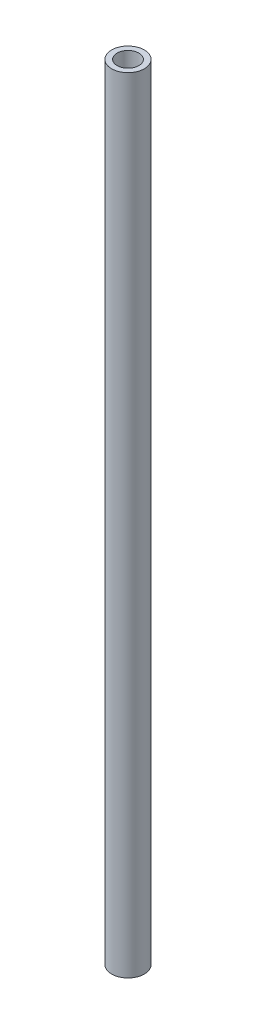
ISO-10303-21;
HEADER;
FILE_DESCRIPTION(('STEP AP214'),'2;1');
FILE_NAME('part.step','',(''),(''),'','','');
FILE_SCHEMA(('AUTOMOTIVE_DESIGN { 1 0 10303 214 1 1 1 1 }'));
ENDSEC;
DATA;
#1=APPLICATION_CONTEXT('core data for automotive mechanical design processes');
#2=APPLICATION_PROTOCOL_DEFINITION('international standard','automotive_design',2000,#1);
#3=PRODUCT_CONTEXT('',#1,'mechanical');
#4=PRODUCT('Part','Part','',(#3));
#5=PRODUCT_RELATED_PRODUCT_CATEGORY('part','',(#4));
#6=PRODUCT_DEFINITION_FORMATION('','',#4);
#7=PRODUCT_DEFINITION_CONTEXT('part definition',#1,'design');
#8=PRODUCT_DEFINITION('design','',#6,#7);
#9=PRODUCT_DEFINITION_SHAPE('','',#8);
#10=(LENGTH_UNIT() NAMED_UNIT(*) SI_UNIT(.MILLI.,.METRE.));
#11=(NAMED_UNIT(*) PLANE_ANGLE_UNIT() SI_UNIT($,.RADIAN.));
#12=(NAMED_UNIT(*) SI_UNIT($,.STERADIAN.) SOLID_ANGLE_UNIT());
#13=UNCERTAINTY_MEASURE_WITH_UNIT(LENGTH_MEASURE(1.E-05),#10,'distance_accuracy_value','');
#14=(GEOMETRIC_REPRESENTATION_CONTEXT(3) GLOBAL_UNCERTAINTY_ASSIGNED_CONTEXT((#13)) GLOBAL_UNIT_ASSIGNED_CONTEXT((#10,
#11,#12)) REPRESENTATION_CONTEXT('',''));
#15=CARTESIAN_POINT('',(0.,0.,0.));
#16=DIRECTION('',(0.,0.,1.));
#17=DIRECTION('',(1.,0.,0.));
#18=AXIS2_PLACEMENT_3D('',#15,#16,#17);
#19=CARTESIAN_POINT('',(0.,914.4,0.));
#20=DIRECTION('',(0.,1.,0.));
#21=DIRECTION('',(0.,0.,1.));
#22=AXIS2_PLACEMENT_3D('',#19,#20,#21);
#23=PLANE('',#22);
#24=CARTESIAN_POINT('',(0.,914.4,0.));
#25=DIRECTION('',(0.,1.,0.));
#26=DIRECTION('',(0.,0.,1.));
#27=AXIS2_PLACEMENT_3D('',#24,#25,#26);
#28=CIRCLE('',#27,19.05);
#29=CARTESIAN_POINT('',(0.,914.4,19.05));
#30=VERTEX_POINT('',#29);
#31=EDGE_CURVE('E10',#30,#30,#28,.T.);
#32=ORIENTED_EDGE('',*,*,#31,.T.);
#33=EDGE_LOOP('',(#32));
#34=FACE_BOUND('',#33,.T.);
#35=CARTESIAN_POINT('',(0.,914.4,0.));
#36=DIRECTION('',(0.,1.,0.));
#37=DIRECTION('',(0.,0.,1.));
#38=AXIS2_PLACEMENT_3D('',#35,#36,#37);
#39=CIRCLE('',#38,12.7);
#40=CARTESIAN_POINT('',(0.,914.4,12.7));
#41=VERTEX_POINT('',#40);
#42=EDGE_CURVE('E42',#41,#41,#39,.T.);
#43=ORIENTED_EDGE('',*,*,#42,.F.);
#44=EDGE_LOOP('',(#43));
#45=FACE_BOUND('',#44,.T.);
#46=ADVANCED_FACE('F31',(#34,#45),#23,.T.);
#47=CARTESIAN_POINT('',(0.,0.,0.));
#48=DIRECTION('',(0.,1.,0.));
#49=DIRECTION('',(0.,0.,1.));
#50=AXIS2_PLACEMENT_3D('',#47,#48,#49);
#51=PLANE('',#50);
#52=CARTESIAN_POINT('',(0.,0.,0.));
#53=DIRECTION('',(0.,1.,0.));
#54=DIRECTION('',(0.,0.,1.));
#55=AXIS2_PLACEMENT_3D('',#52,#53,#54);
#56=CIRCLE('',#55,19.05);
#57=CARTESIAN_POINT('',(0.,0.,19.05));
#58=VERTEX_POINT('',#57);
#59=EDGE_CURVE('E35',#58,#58,#56,.T.);
#60=ORIENTED_EDGE('',*,*,#59,.F.);
#61=EDGE_LOOP('',(#60));
#62=FACE_BOUND('',#61,.T.);
#63=CARTESIAN_POINT('',(0.,0.,0.));
#64=DIRECTION('',(0.,1.,0.));
#65=DIRECTION('',(0.,0.,1.));
#66=AXIS2_PLACEMENT_3D('',#63,#64,#65);
#67=CIRCLE('',#66,12.7);
#68=CARTESIAN_POINT('',(0.,0.,12.7));
#69=VERTEX_POINT('',#68);
#70=EDGE_CURVE('E44',#69,#69,#67,.T.);
#71=ORIENTED_EDGE('',*,*,#70,.T.);
#72=EDGE_LOOP('',(#71));
#73=FACE_BOUND('',#72,.T.);
#74=ADVANCED_FACE('F54',(#62,#73),#51,.F.);
#75=CARTESIAN_POINT('',(0.,914.4,0.));
#76=DIRECTION('',(0.,-1.,0.));
#77=DIRECTION('',(0.,0.,-1.));
#78=AXIS2_PLACEMENT_3D('',#75,#76,#77);
#79=CYLINDRICAL_SURFACE('',#78,19.05);
#80=ORIENTED_EDGE('',*,*,#31,.F.);
#81=EDGE_LOOP('',(#80));
#82=FACE_BOUND('',#81,.T.);
#83=ORIENTED_EDGE('',*,*,#59,.T.);
#84=EDGE_LOOP('',(#83));
#85=FACE_BOUND('',#84,.T.);
#86=ADVANCED_FACE('F33',(#82,#85),#79,.T.);
#87=CARTESIAN_POINT('',(0.,914.4,0.));
#88=DIRECTION('',(0.,-1.,0.));
#89=DIRECTION('',(0.,0.,-1.));
#90=AXIS2_PLACEMENT_3D('',#87,#88,#89);
#91=CYLINDRICAL_SURFACE('',#90,12.7);
#92=ORIENTED_EDGE('',*,*,#42,.T.);
#93=EDGE_LOOP('',(#92));
#94=FACE_BOUND('',#93,.T.);
#95=ORIENTED_EDGE('',*,*,#70,.F.);
#96=EDGE_LOOP('',(#95));
#97=FACE_BOUND('',#96,.T.);
#98=ADVANCED_FACE('F50',(#94,#97),#91,.F.);
#99=CLOSED_SHELL('',(#46,#74,#86,#98));
#100=MANIFOLD_SOLID_BREP('B2',#99);
#101=ADVANCED_BREP_SHAPE_REPRESENTATION('',(#18,#100),#14);
#102=SHAPE_DEFINITION_REPRESENTATION(#9,#101);
ENDSEC;
END-ISO-10303-21;
